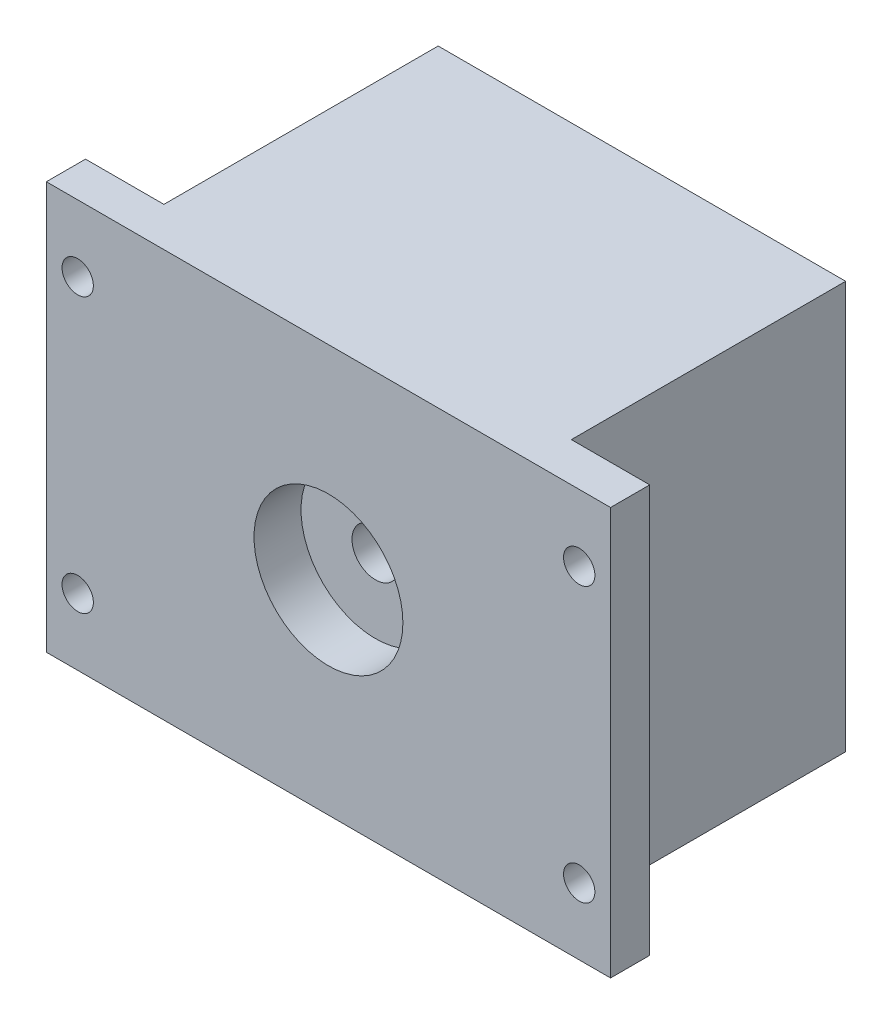
ISO-10303-21;
HEADER;
FILE_DESCRIPTION(('STEP AP214'),'2;1');
FILE_NAME('part.step','',(''),(''),'','','');
FILE_SCHEMA(('AUTOMOTIVE_DESIGN { 1 0 10303 214 1 1 1 1 }'));
ENDSEC;
DATA;
#1=APPLICATION_CONTEXT('core data for automotive mechanical design processes');
#2=APPLICATION_PROTOCOL_DEFINITION('international standard','automotive_design',2000,#1);
#3=PRODUCT_CONTEXT('',#1,'mechanical');
#4=PRODUCT('Part','Part','',(#3));
#5=PRODUCT_RELATED_PRODUCT_CATEGORY('part','',(#4));
#6=PRODUCT_DEFINITION_FORMATION('','',#4);
#7=PRODUCT_DEFINITION_CONTEXT('part definition',#1,'design');
#8=PRODUCT_DEFINITION('design','',#6,#7);
#9=PRODUCT_DEFINITION_SHAPE('','',#8);
#10=(LENGTH_UNIT() NAMED_UNIT(*) SI_UNIT(.MILLI.,.METRE.));
#11=(NAMED_UNIT(*) PLANE_ANGLE_UNIT() SI_UNIT($,.RADIAN.));
#12=(NAMED_UNIT(*) SI_UNIT($,.STERADIAN.) SOLID_ANGLE_UNIT());
#13=UNCERTAINTY_MEASURE_WITH_UNIT(LENGTH_MEASURE(1.E-05),#10,'distance_accuracy_value','');
#14=(GEOMETRIC_REPRESENTATION_CONTEXT(3) GLOBAL_UNCERTAINTY_ASSIGNED_CONTEXT((#13)) GLOBAL_UNIT_ASSIGNED_CONTEXT((#10,
#11,#12)) REPRESENTATION_CONTEXT('',''));
#15=CARTESIAN_POINT('',(0.,0.,0.));
#16=DIRECTION('',(0.,0.,1.));
#17=DIRECTION('',(1.,0.,0.));
#18=AXIS2_PLACEMENT_3D('',#15,#16,#17);
#19=CARTESIAN_POINT('',(-26.,-26.,40.));
#20=DIRECTION('',(-1.,0.,0.));
#21=DIRECTION('',(0.,0.,1.));
#22=AXIS2_PLACEMENT_3D('',#19,#20,#21);
#23=PLANE('',#22);
#24=DIRECTION('',(0.,0.,-1.));
#25=VECTOR('',#24,1.);
#26=CARTESIAN_POINT('',(-26.,-26.,40.));
#27=LINE('',#26,#25);
#28=CARTESIAN_POINT('',(-26.,-26.,35.));
#29=VERTEX_POINT('',#28);
#30=CARTESIAN_POINT('',(-26.,-26.,0.));
#31=VERTEX_POINT('',#30);
#32=EDGE_CURVE('E45',#29,#31,#27,.T.);
#33=ORIENTED_EDGE('',*,*,#32,.F.);
#34=DIRECTION('',(0.,1.,0.));
#35=VECTOR('',#34,1.);
#36=CARTESIAN_POINT('',(-26.,26.,35.));
#37=LINE('',#36,#35);
#38=CARTESIAN_POINT('',(-26.,26.,35.));
#39=VERTEX_POINT('',#38);
#40=EDGE_CURVE('E120',#29,#39,#37,.T.);
#41=ORIENTED_EDGE('',*,*,#40,.T.);
#42=DIRECTION('',(0.,0.,-1.));
#43=VECTOR('',#42,1.);
#44=CARTESIAN_POINT('',(-26.,26.,40.));
#45=LINE('',#44,#43);
#46=CARTESIAN_POINT('',(-26.,26.,0.));
#47=VERTEX_POINT('',#46);
#48=EDGE_CURVE('E11',#39,#47,#45,.T.);
#49=ORIENTED_EDGE('',*,*,#48,.T.);
#50=DIRECTION('',(0.,1.,0.));
#51=VECTOR('',#50,1.);
#52=CARTESIAN_POINT('',(-26.,-26.,0.));
#53=LINE('',#52,#51);
#54=EDGE_CURVE('E170',#31,#47,#53,.T.);
#55=ORIENTED_EDGE('',*,*,#54,.F.);
#56=EDGE_LOOP('',(#33,#41,#49,#55));
#57=FACE_BOUND('',#56,.T.);
#58=ADVANCED_FACE('F36',(#57),#23,.T.);
#59=CARTESIAN_POINT('',(0.,0.,0.));
#60=DIRECTION('',(0.,0.,1.));
#61=DIRECTION('',(1.,0.,0.));
#62=AXIS2_PLACEMENT_3D('',#59,#60,#61);
#63=CYLINDRICAL_SURFACE('',#62,3.);
#64=CARTESIAN_POINT('',(0.,0.,34.));
#65=DIRECTION('',(0.,0.,1.));
#66=DIRECTION('',(1.,0.,0.));
#67=AXIS2_PLACEMENT_3D('',#64,#65,#66);
#68=CIRCLE('',#67,3.);
#69=CARTESIAN_POINT('',(3.,0.,34.));
#70=VERTEX_POINT('',#69);
#71=EDGE_CURVE('E153',#70,#70,#68,.T.);
#72=ORIENTED_EDGE('',*,*,#71,.T.);
#73=EDGE_LOOP('',(#72));
#74=FACE_BOUND('',#73,.T.);
#75=CARTESIAN_POINT('',(0.,0.,6.));
#76=DIRECTION('',(0.,0.,-1.));
#77=DIRECTION('',(-1.,0.,0.));
#78=AXIS2_PLACEMENT_3D('',#75,#76,#77);
#79=CIRCLE('',#78,3.);
#80=CARTESIAN_POINT('',(-3.,0.,6.));
#81=VERTEX_POINT('',#80);
#82=EDGE_CURVE('E40',#81,#81,#79,.F.);
#83=ORIENTED_EDGE('',*,*,#82,.F.);
#84=EDGE_LOOP('',(#83));
#85=FACE_BOUND('',#84,.T.);
#86=ADVANCED_FACE('F215',(#74,#85),#63,.F.);
#87=CARTESIAN_POINT('',(26.,26.,40.));
#88=DIRECTION('',(0.,-1.,0.));
#89=DIRECTION('',(0.,0.,-1.));
#90=AXIS2_PLACEMENT_3D('',#87,#88,#89);
#91=PLANE('',#90);
#92=DIRECTION('',(-1.,0.,0.));
#93=VECTOR('',#92,1.);
#94=CARTESIAN_POINT('',(26.,26.,0.));
#95=LINE('',#94,#93);
#96=CARTESIAN_POINT('',(26.,26.,0.));
#97=VERTEX_POINT('',#96);
#98=EDGE_CURVE('E160',#97,#47,#95,.T.);
#99=ORIENTED_EDGE('',*,*,#98,.T.);
#100=ORIENTED_EDGE('',*,*,#48,.F.);
#101=DIRECTION('',(-1.,0.,0.));
#102=VECTOR('',#101,1.);
#103=CARTESIAN_POINT('',(-26.,26.,35.));
#104=LINE('',#103,#102);
#105=CARTESIAN_POINT('',(-36.,26.,35.));
#106=VERTEX_POINT('',#105);
#107=EDGE_CURVE('E52',#39,#106,#104,.T.);
#108=ORIENTED_EDGE('',*,*,#107,.T.);
#109=DIRECTION('',(0.,0.,1.));
#110=VECTOR('',#109,1.);
#111=CARTESIAN_POINT('',(-36.,26.,35.));
#112=LINE('',#111,#110);
#113=CARTESIAN_POINT('',(-36.,26.,40.));
#114=VERTEX_POINT('',#113);
#115=EDGE_CURVE('E104',#106,#114,#112,.T.);
#116=ORIENTED_EDGE('',*,*,#115,.T.);
#117=DIRECTION('',(-1.,0.,0.));
#118=VECTOR('',#117,1.);
#119=CARTESIAN_POINT('',(26.,26.,40.));
#120=LINE('',#119,#118);
#121=CARTESIAN_POINT('',(36.,26.,40.));
#122=VERTEX_POINT('',#121);
#123=EDGE_CURVE('E163',#122,#114,#120,.T.);
#124=ORIENTED_EDGE('',*,*,#123,.F.);
#125=DIRECTION('',(0.,0.,1.));
#126=VECTOR('',#125,1.);
#127=CARTESIAN_POINT('',(36.,26.,35.));
#128=LINE('',#127,#126);
#129=CARTESIAN_POINT('',(36.,26.,35.));
#130=VERTEX_POINT('',#129);
#131=EDGE_CURVE('E142',#130,#122,#128,.T.);
#132=ORIENTED_EDGE('',*,*,#131,.F.);
#133=DIRECTION('',(-1.,0.,0.));
#134=VECTOR('',#133,1.);
#135=CARTESIAN_POINT('',(26.,26.,35.));
#136=LINE('',#135,#134);
#137=CARTESIAN_POINT('',(26.,26.,35.));
#138=VERTEX_POINT('',#137);
#139=EDGE_CURVE('E136',#130,#138,#136,.T.);
#140=ORIENTED_EDGE('',*,*,#139,.T.);
#141=DIRECTION('',(0.,0.,-1.));
#142=VECTOR('',#141,1.);
#143=CARTESIAN_POINT('',(26.,26.,40.));
#144=LINE('',#143,#142);
#145=EDGE_CURVE('E168',#138,#97,#144,.T.);
#146=ORIENTED_EDGE('',*,*,#145,.T.);
#147=EDGE_LOOP('',(#99,#100,#108,#116,#124,#132,#140,#146));
#148=FACE_BOUND('',#147,.T.);
#149=ADVANCED_FACE('F38',(#148),#91,.F.);
#150=CARTESIAN_POINT('',(26.,-26.,40.));
#151=DIRECTION('',(0.,-1.,0.));
#152=DIRECTION('',(0.,0.,-1.));
#153=AXIS2_PLACEMENT_3D('',#150,#151,#152);
#154=PLANE('',#153);
#155=DIRECTION('',(-1.,0.,0.));
#156=VECTOR('',#155,1.);
#157=CARTESIAN_POINT('',(26.,-26.,0.));
#158=LINE('',#157,#156);
#159=CARTESIAN_POINT('',(26.,-26.,0.));
#160=VERTEX_POINT('',#159);
#161=EDGE_CURVE('E173',#160,#31,#158,.T.);
#162=ORIENTED_EDGE('',*,*,#161,.F.);
#163=DIRECTION('',(0.,0.,-1.));
#164=VECTOR('',#163,1.);
#165=CARTESIAN_POINT('',(26.,-26.,40.));
#166=LINE('',#165,#164);
#167=CARTESIAN_POINT('',(26.,-26.,35.));
#168=VERTEX_POINT('',#167);
#169=EDGE_CURVE('E179',#168,#160,#166,.T.);
#170=ORIENTED_EDGE('',*,*,#169,.F.);
#171=DIRECTION('',(1.,0.,0.));
#172=VECTOR('',#171,1.);
#173=CARTESIAN_POINT('',(26.,-26.,35.));
#174=LINE('',#173,#172);
#175=CARTESIAN_POINT('',(36.,-26.,35.));
#176=VERTEX_POINT('',#175);
#177=EDGE_CURVE('E60',#168,#176,#174,.T.);
#178=ORIENTED_EDGE('',*,*,#177,.T.);
#179=DIRECTION('',(0.,0.,1.));
#180=VECTOR('',#179,1.);
#181=CARTESIAN_POINT('',(36.,-26.,35.));
#182=LINE('',#181,#180);
#183=CARTESIAN_POINT('',(36.,-26.,40.));
#184=VERTEX_POINT('',#183);
#185=EDGE_CURVE('E139',#176,#184,#182,.T.);
#186=ORIENTED_EDGE('',*,*,#185,.T.);
#187=DIRECTION('',(-1.,0.,0.));
#188=VECTOR('',#187,1.);
#189=CARTESIAN_POINT('',(26.,-26.,40.));
#190=LINE('',#189,#188);
#191=CARTESIAN_POINT('',(-36.,-26.,40.));
#192=VERTEX_POINT('',#191);
#193=EDGE_CURVE('E165',#184,#192,#190,.T.);
#194=ORIENTED_EDGE('',*,*,#193,.T.);
#195=DIRECTION('',(0.,0.,1.));
#196=VECTOR('',#195,1.);
#197=CARTESIAN_POINT('',(-36.,-26.,35.));
#198=LINE('',#197,#196);
#199=CARTESIAN_POINT('',(-36.,-26.,35.));
#200=VERTEX_POINT('',#199);
#201=EDGE_CURVE('E112',#200,#192,#198,.T.);
#202=ORIENTED_EDGE('',*,*,#201,.F.);
#203=DIRECTION('',(1.,0.,0.));
#204=VECTOR('',#203,1.);
#205=CARTESIAN_POINT('',(-26.,-26.,35.));
#206=LINE('',#205,#204);
#207=EDGE_CURVE('E113',#200,#29,#206,.T.);
#208=ORIENTED_EDGE('',*,*,#207,.T.);
#209=ORIENTED_EDGE('',*,*,#32,.T.);
#210=EDGE_LOOP('',(#162,#170,#178,#186,#194,#202,#208,#209));
#211=FACE_BOUND('',#210,.T.);
#212=ADVANCED_FACE('F185',(#211),#154,.T.);
#213=CARTESIAN_POINT('',(26.,-26.,40.));
#214=DIRECTION('',(-1.,0.,0.));
#215=DIRECTION('',(0.,0.,1.));
#216=AXIS2_PLACEMENT_3D('',#213,#214,#215);
#217=PLANE('',#216);
#218=ORIENTED_EDGE('',*,*,#145,.F.);
#219=DIRECTION('',(0.,-1.,0.));
#220=VECTOR('',#219,1.);
#221=CARTESIAN_POINT('',(26.,26.,35.));
#222=LINE('',#221,#220);
#223=EDGE_CURVE('E130',#138,#168,#222,.T.);
#224=ORIENTED_EDGE('',*,*,#223,.T.);
#225=ORIENTED_EDGE('',*,*,#169,.T.);
#226=DIRECTION('',(0.,1.,0.));
#227=VECTOR('',#226,1.);
#228=CARTESIAN_POINT('',(26.,-26.,0.));
#229=LINE('',#228,#227);
#230=EDGE_CURVE('E166',#160,#97,#229,.T.);
#231=ORIENTED_EDGE('',*,*,#230,.T.);
#232=EDGE_LOOP('',(#218,#224,#225,#231));
#233=FACE_BOUND('',#232,.T.);
#234=ADVANCED_FACE('F194',(#233),#217,.F.);
#235=CARTESIAN_POINT('',(0.,0.,40.));
#236=DIRECTION('',(0.,0.,-1.));
#237=DIRECTION('',(-1.,0.,0.));
#238=AXIS2_PLACEMENT_3D('',#235,#236,#237);
#239=PLANE('',#238);
#240=CARTESIAN_POINT('',(32.,-17.5,40.));
#241=DIRECTION('',(0.,0.,-1.));
#242=DIRECTION('',(-1.,0.,0.));
#243=AXIS2_PLACEMENT_3D('',#240,#241,#242);
#244=CIRCLE('',#243,2.);
#245=CARTESIAN_POINT('',(30.,-17.5,40.));
#246=VERTEX_POINT('',#245);
#247=EDGE_CURVE('E343',#246,#246,#244,.T.);
#248=ORIENTED_EDGE('',*,*,#247,.T.);
#249=EDGE_LOOP('',(#248));
#250=FACE_BOUND('',#249,.T.);
#251=CARTESIAN_POINT('',(-32.,-17.5,40.));
#252=DIRECTION('',(0.,0.,-1.));
#253=DIRECTION('',(-1.,0.,0.));
#254=AXIS2_PLACEMENT_3D('',#251,#252,#253);
#255=CIRCLE('',#254,2.);
#256=CARTESIAN_POINT('',(-34.,-17.5,40.));
#257=VERTEX_POINT('',#256);
#258=EDGE_CURVE('E363',#257,#257,#255,.T.);
#259=ORIENTED_EDGE('',*,*,#258,.T.);
#260=EDGE_LOOP('',(#259));
#261=FACE_BOUND('',#260,.T.);
#262=CARTESIAN_POINT('',(-32.,17.5,40.));
#263=DIRECTION('',(0.,0.,-1.));
#264=DIRECTION('',(-1.,0.,0.));
#265=AXIS2_PLACEMENT_3D('',#262,#263,#264);
#266=CIRCLE('',#265,2.);
#267=CARTESIAN_POINT('',(-34.,17.5,40.));
#268=VERTEX_POINT('',#267);
#269=EDGE_CURVE('E354',#268,#268,#266,.T.);
#270=ORIENTED_EDGE('',*,*,#269,.T.);
#271=EDGE_LOOP('',(#270));
#272=FACE_BOUND('',#271,.T.);
#273=CARTESIAN_POINT('',(32.,17.5,40.));
#274=DIRECTION('',(0.,0.,-1.));
#275=DIRECTION('',(-1.,0.,0.));
#276=AXIS2_PLACEMENT_3D('',#273,#274,#275);
#277=CIRCLE('',#276,2.);
#278=CARTESIAN_POINT('',(30.,17.5,40.));
#279=VERTEX_POINT('',#278);
#280=EDGE_CURVE('E127',#279,#279,#277,.T.);
#281=ORIENTED_EDGE('',*,*,#280,.T.);
#282=EDGE_LOOP('',(#281));
#283=FACE_BOUND('',#282,.T.);
#284=CARTESIAN_POINT('',(0.,0.,40.));
#285=DIRECTION('',(0.,0.,1.));
#286=DIRECTION('',(1.,0.,0.));
#287=AXIS2_PLACEMENT_3D('',#284,#285,#286);
#288=CIRCLE('',#287,9.5);
#289=CARTESIAN_POINT('',(9.5,0.,40.));
#290=VERTEX_POINT('',#289);
#291=EDGE_CURVE('E157',#290,#290,#288,.T.);
#292=ORIENTED_EDGE('',*,*,#291,.F.);
#293=EDGE_LOOP('',(#292));
#294=FACE_BOUND('',#293,.T.);
#295=ORIENTED_EDGE('',*,*,#123,.T.);
#296=DIRECTION('',(0.,-1.,0.));
#297=VECTOR('',#296,1.);
#298=CARTESIAN_POINT('',(-36.,26.,40.));
#299=LINE('',#298,#297);
#300=EDGE_CURVE('E110',#114,#192,#299,.T.);
#301=ORIENTED_EDGE('',*,*,#300,.T.);
#302=ORIENTED_EDGE('',*,*,#193,.F.);
#303=DIRECTION('',(0.,1.,0.));
#304=VECTOR('',#303,1.);
#305=CARTESIAN_POINT('',(36.,26.,40.));
#306=LINE('',#305,#304);
#307=EDGE_CURVE('E128',#184,#122,#306,.T.);
#308=ORIENTED_EDGE('',*,*,#307,.T.);
#309=EDGE_LOOP('',(#295,#301,#302,#308));
#310=FACE_BOUND('',#309,.T.);
#311=ADVANCED_FACE('F199',(#250,#261,#272,#283,#294,#310),#239,.F.);
#312=CARTESIAN_POINT('',(0.,0.,0.));
#313=DIRECTION('',(0.,0.,-1.));
#314=DIRECTION('',(-1.,0.,0.));
#315=AXIS2_PLACEMENT_3D('',#312,#313,#314);
#316=PLANE('',#315);
#317=CARTESIAN_POINT('',(0.,0.,0.));
#318=DIRECTION('',(0.,0.,-1.));
#319=DIRECTION('',(-1.,0.,0.));
#320=AXIS2_PLACEMENT_3D('',#317,#318,#319);
#321=CIRCLE('',#320,9.5);
#322=CARTESIAN_POINT('',(-9.5,0.,0.));
#323=VERTEX_POINT('',#322);
#324=EDGE_CURVE('E145',#323,#323,#321,.T.);
#325=ORIENTED_EDGE('',*,*,#324,.F.);
#326=EDGE_LOOP('',(#325));
#327=FACE_BOUND('',#326,.T.);
#328=ORIENTED_EDGE('',*,*,#98,.F.);
#329=ORIENTED_EDGE('',*,*,#230,.F.);
#330=ORIENTED_EDGE('',*,*,#161,.T.);
#331=ORIENTED_EDGE('',*,*,#54,.T.);
#332=EDGE_LOOP('',(#328,#329,#330,#331));
#333=FACE_BOUND('',#332,.T.);
#334=ADVANCED_FACE('F191',(#327,#333),#316,.T.);
#335=CARTESIAN_POINT('',(0.,0.,34.));
#336=DIRECTION('',(0.,0.,1.));
#337=DIRECTION('',(1.,0.,0.));
#338=AXIS2_PLACEMENT_3D('',#335,#336,#337);
#339=CYLINDRICAL_SURFACE('',#338,9.5);
#340=CARTESIAN_POINT('',(0.,0.,34.));
#341=DIRECTION('',(0.,0.,1.));
#342=DIRECTION('',(1.,0.,0.));
#343=AXIS2_PLACEMENT_3D('',#340,#341,#342);
#344=CIRCLE('',#343,9.5);
#345=CARTESIAN_POINT('',(9.5,0.,34.));
#346=VERTEX_POINT('',#345);
#347=EDGE_CURVE('E156',#346,#346,#344,.T.);
#348=ORIENTED_EDGE('',*,*,#347,.F.);
#349=EDGE_LOOP('',(#348));
#350=FACE_BOUND('',#349,.T.);
#351=ORIENTED_EDGE('',*,*,#291,.T.);
#352=EDGE_LOOP('',(#351));
#353=FACE_BOUND('',#352,.T.);
#354=ADVANCED_FACE('F228',(#350,#353),#339,.F.);
#355=CARTESIAN_POINT('',(0.,0.,34.));
#356=DIRECTION('',(0.,0.,1.));
#357=DIRECTION('',(1.,0.,0.));
#358=AXIS2_PLACEMENT_3D('',#355,#356,#357);
#359=PLANE('',#358);
#360=ORIENTED_EDGE('',*,*,#71,.F.);
#361=EDGE_LOOP('',(#360));
#362=FACE_BOUND('',#361,.T.);
#363=ORIENTED_EDGE('',*,*,#347,.T.);
#364=EDGE_LOOP('',(#363));
#365=FACE_BOUND('',#364,.T.);
#366=ADVANCED_FACE('F235',(#362,#365),#359,.T.);
#367=CARTESIAN_POINT('',(0.,0.,6.));
#368=DIRECTION('',(0.,0.,-1.));
#369=DIRECTION('',(-1.,0.,0.));
#370=AXIS2_PLACEMENT_3D('',#367,#368,#369);
#371=PLANE('',#370);
#372=CARTESIAN_POINT('',(0.,0.,6.));
#373=DIRECTION('',(0.,0.,-1.));
#374=DIRECTION('',(-1.,0.,0.));
#375=AXIS2_PLACEMENT_3D('',#372,#373,#374);
#376=CIRCLE('',#375,9.5);
#377=CARTESIAN_POINT('',(-9.5,0.,6.));
#378=VERTEX_POINT('',#377);
#379=EDGE_CURVE('E148',#378,#378,#376,.T.);
#380=ORIENTED_EDGE('',*,*,#379,.T.);
#381=EDGE_LOOP('',(#380));
#382=FACE_BOUND('',#381,.T.);
#383=ORIENTED_EDGE('',*,*,#82,.T.);
#384=EDGE_LOOP('',(#383));
#385=FACE_BOUND('',#384,.T.);
#386=ADVANCED_FACE('F239',(#382,#385),#371,.T.);
#387=CARTESIAN_POINT('',(0.,0.,6.));
#388=DIRECTION('',(0.,0.,-1.));
#389=DIRECTION('',(-1.,0.,0.));
#390=AXIS2_PLACEMENT_3D('',#387,#388,#389);
#391=CYLINDRICAL_SURFACE('',#390,9.5);
#392=ORIENTED_EDGE('',*,*,#379,.F.);
#393=EDGE_LOOP('',(#392));
#394=FACE_BOUND('',#393,.T.);
#395=ORIENTED_EDGE('',*,*,#324,.T.);
#396=EDGE_LOOP('',(#395));
#397=FACE_BOUND('',#396,.T.);
#398=ADVANCED_FACE('F210',(#394,#397),#391,.F.);
#399=CARTESIAN_POINT('',(36.,26.,35.));
#400=DIRECTION('',(1.,0.,0.));
#401=DIRECTION('',(0.,1.,0.));
#402=AXIS2_PLACEMENT_3D('',#399,#400,#401);
#403=PLANE('',#402);
#404=ORIENTED_EDGE('',*,*,#307,.F.);
#405=ORIENTED_EDGE('',*,*,#185,.F.);
#406=DIRECTION('',(0.,1.,0.));
#407=VECTOR('',#406,1.);
#408=CARTESIAN_POINT('',(36.,26.,35.));
#409=LINE('',#408,#407);
#410=EDGE_CURVE('E133',#176,#130,#409,.T.);
#411=ORIENTED_EDGE('',*,*,#410,.T.);
#412=ORIENTED_EDGE('',*,*,#131,.T.);
#413=EDGE_LOOP('',(#404,#405,#411,#412));
#414=FACE_BOUND('',#413,.T.);
#415=ADVANCED_FACE('F197',(#414),#403,.T.);
#416=CARTESIAN_POINT('',(0.,0.,35.));
#417=DIRECTION('',(0.,0.,1.));
#418=DIRECTION('',(1.,0.,0.));
#419=AXIS2_PLACEMENT_3D('',#416,#417,#418);
#420=PLANE('',#419);
#421=CARTESIAN_POINT('',(32.,-17.5,35.));
#422=DIRECTION('',(0.,0.,-1.));
#423=DIRECTION('',(-1.,0.,0.));
#424=AXIS2_PLACEMENT_3D('',#421,#422,#423);
#425=CIRCLE('',#424,2.);
#426=CARTESIAN_POINT('',(30.,-17.5,35.));
#427=VERTEX_POINT('',#426);
#428=EDGE_CURVE('E345',#427,#427,#425,.T.);
#429=ORIENTED_EDGE('',*,*,#428,.F.);
#430=EDGE_LOOP('',(#429));
#431=FACE_BOUND('',#430,.T.);
#432=CARTESIAN_POINT('',(32.,17.5,35.));
#433=DIRECTION('',(0.,0.,-1.));
#434=DIRECTION('',(-1.,0.,0.));
#435=AXIS2_PLACEMENT_3D('',#432,#433,#434);
#436=CIRCLE('',#435,2.);
#437=CARTESIAN_POINT('',(30.,17.5,35.));
#438=VERTEX_POINT('',#437);
#439=EDGE_CURVE('E352',#438,#438,#436,.T.);
#440=ORIENTED_EDGE('',*,*,#439,.F.);
#441=EDGE_LOOP('',(#440));
#442=FACE_BOUND('',#441,.T.);
#443=ORIENTED_EDGE('',*,*,#223,.F.);
#444=ORIENTED_EDGE('',*,*,#139,.F.);
#445=ORIENTED_EDGE('',*,*,#410,.F.);
#446=ORIENTED_EDGE('',*,*,#177,.F.);
#447=EDGE_LOOP('',(#443,#444,#445,#446));
#448=FACE_BOUND('',#447,.T.);
#449=ADVANCED_FACE('F201',(#431,#442,#448),#420,.F.);
#450=CARTESIAN_POINT('',(-36.,26.,35.));
#451=DIRECTION('',(-1.,0.,0.));
#452=DIRECTION('',(0.,-1.,0.));
#453=AXIS2_PLACEMENT_3D('',#450,#451,#452);
#454=PLANE('',#453);
#455=ORIENTED_EDGE('',*,*,#300,.F.);
#456=ORIENTED_EDGE('',*,*,#115,.F.);
#457=DIRECTION('',(0.,-1.,0.));
#458=VECTOR('',#457,1.);
#459=CARTESIAN_POINT('',(-36.,26.,35.));
#460=LINE('',#459,#458);
#461=EDGE_CURVE('E107',#106,#200,#460,.T.);
#462=ORIENTED_EDGE('',*,*,#461,.T.);
#463=ORIENTED_EDGE('',*,*,#201,.T.);
#464=EDGE_LOOP('',(#455,#456,#462,#463));
#465=FACE_BOUND('',#464,.T.);
#466=ADVANCED_FACE('F105',(#465),#454,.T.);
#467=CARTESIAN_POINT('',(0.,0.,35.));
#468=DIRECTION('',(0.,0.,-1.));
#469=DIRECTION('',(-1.,0.,0.));
#470=AXIS2_PLACEMENT_3D('',#467,#468,#469);
#471=PLANE('',#470);
#472=CARTESIAN_POINT('',(-32.,-17.5,35.));
#473=DIRECTION('',(0.,0.,-1.));
#474=DIRECTION('',(-1.,0.,0.));
#475=AXIS2_PLACEMENT_3D('',#472,#473,#474);
#476=CIRCLE('',#475,2.);
#477=CARTESIAN_POINT('',(-34.,-17.5,35.));
#478=VERTEX_POINT('',#477);
#479=EDGE_CURVE('E347',#478,#478,#476,.T.);
#480=ORIENTED_EDGE('',*,*,#479,.F.);
#481=EDGE_LOOP('',(#480));
#482=FACE_BOUND('',#481,.T.);
#483=CARTESIAN_POINT('',(-32.,17.5,35.));
#484=DIRECTION('',(0.,0.,-1.));
#485=DIRECTION('',(-1.,0.,0.));
#486=AXIS2_PLACEMENT_3D('',#483,#484,#485);
#487=CIRCLE('',#486,2.);
#488=CARTESIAN_POINT('',(-34.,17.5,35.));
#489=VERTEX_POINT('',#488);
#490=EDGE_CURVE('E358',#489,#489,#487,.T.);
#491=ORIENTED_EDGE('',*,*,#490,.F.);
#492=EDGE_LOOP('',(#491));
#493=FACE_BOUND('',#492,.T.);
#494=ORIENTED_EDGE('',*,*,#40,.F.);
#495=ORIENTED_EDGE('',*,*,#207,.F.);
#496=ORIENTED_EDGE('',*,*,#461,.F.);
#497=ORIENTED_EDGE('',*,*,#107,.F.);
#498=EDGE_LOOP('',(#494,#495,#496,#497));
#499=FACE_BOUND('',#498,.T.);
#500=ADVANCED_FACE('F115',(#482,#493,#499),#471,.T.);
#501=CARTESIAN_POINT('',(-32.,17.5,40.));
#502=DIRECTION('',(0.,0.,-1.));
#503=DIRECTION('',(-1.,0.,0.));
#504=AXIS2_PLACEMENT_3D('',#501,#502,#503);
#505=CYLINDRICAL_SURFACE('',#504,2.);
#506=ORIENTED_EDGE('',*,*,#269,.F.);
#507=EDGE_LOOP('',(#506));
#508=FACE_BOUND('',#507,.T.);
#509=ORIENTED_EDGE('',*,*,#490,.T.);
#510=EDGE_LOOP('',(#509));
#511=FACE_BOUND('',#510,.T.);
#512=ADVANCED_FACE('F296',(#508,#511),#505,.F.);
#513=CARTESIAN_POINT('',(-32.,-17.5,40.));
#514=DIRECTION('',(0.,0.,-1.));
#515=DIRECTION('',(-1.,0.,0.));
#516=AXIS2_PLACEMENT_3D('',#513,#514,#515);
#517=CYLINDRICAL_SURFACE('',#516,2.);
#518=ORIENTED_EDGE('',*,*,#258,.F.);
#519=EDGE_LOOP('',(#518));
#520=FACE_BOUND('',#519,.T.);
#521=ORIENTED_EDGE('',*,*,#479,.T.);
#522=EDGE_LOOP('',(#521));
#523=FACE_BOUND('',#522,.T.);
#524=ADVANCED_FACE('F306',(#520,#523),#517,.F.);
#525=CARTESIAN_POINT('',(32.,17.5,40.));
#526=DIRECTION('',(0.,0.,-1.));
#527=DIRECTION('',(-1.,0.,0.));
#528=AXIS2_PLACEMENT_3D('',#525,#526,#527);
#529=CYLINDRICAL_SURFACE('',#528,2.);
#530=ORIENTED_EDGE('',*,*,#280,.F.);
#531=EDGE_LOOP('',(#530));
#532=FACE_BOUND('',#531,.T.);
#533=ORIENTED_EDGE('',*,*,#439,.T.);
#534=EDGE_LOOP('',(#533));
#535=FACE_BOUND('',#534,.T.);
#536=ADVANCED_FACE('F316',(#532,#535),#529,.F.);
#537=CARTESIAN_POINT('',(32.,-17.5,40.));
#538=DIRECTION('',(0.,0.,-1.));
#539=DIRECTION('',(-1.,0.,0.));
#540=AXIS2_PLACEMENT_3D('',#537,#538,#539);
#541=CYLINDRICAL_SURFACE('',#540,2.);
#542=ORIENTED_EDGE('',*,*,#247,.F.);
#543=EDGE_LOOP('',(#542));
#544=FACE_BOUND('',#543,.T.);
#545=ORIENTED_EDGE('',*,*,#428,.T.);
#546=EDGE_LOOP('',(#545));
#547=FACE_BOUND('',#546,.T.);
#548=ADVANCED_FACE('F326',(#544,#547),#541,.F.);
#549=CLOSED_SHELL('',(#58,#86,#149,#212,#234,#311,#334,#354,#366,#386,#398,#415,#449,#466,#500,
#512,#524,#536,#548));
#550=MANIFOLD_SOLID_BREP('B2',#549);
#551=ADVANCED_BREP_SHAPE_REPRESENTATION('',(#18,#550),#14);
#552=SHAPE_DEFINITION_REPRESENTATION(#9,#551);
ENDSEC;
END-ISO-10303-21;
